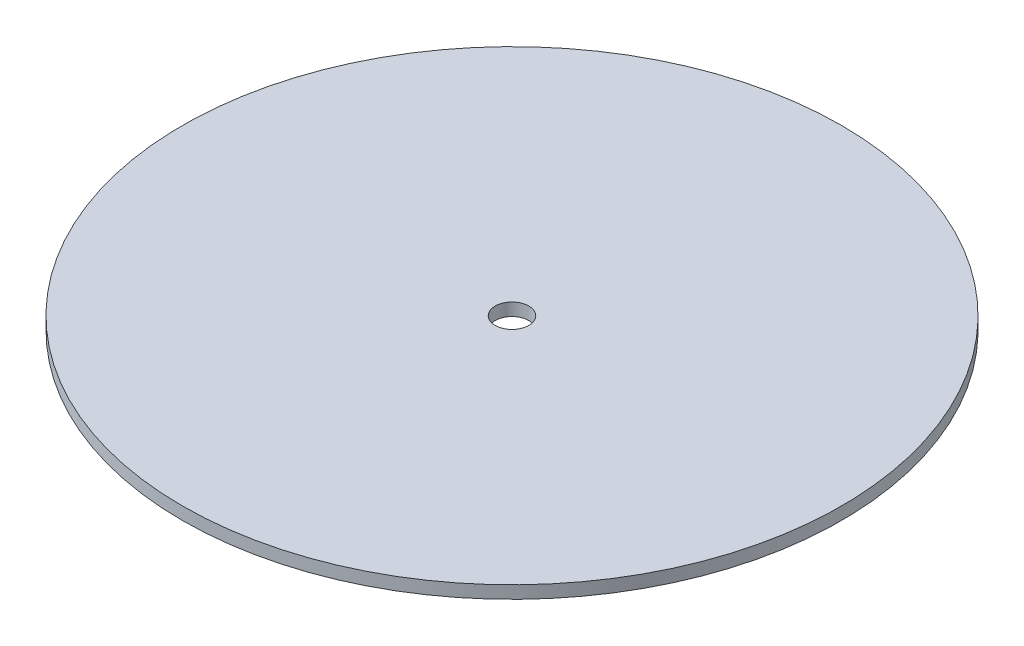
ISO-10303-21;
HEADER;
FILE_DESCRIPTION(('STEP AP214'),'2;1');
FILE_NAME('part.step','',(''),(''),'','','');
FILE_SCHEMA(('AUTOMOTIVE_DESIGN { 1 0 10303 214 1 1 1 1 }'));
ENDSEC;
DATA;
#1=APPLICATION_CONTEXT('core data for automotive mechanical design processes');
#2=APPLICATION_PROTOCOL_DEFINITION('international standard','automotive_design',2000,#1);
#3=PRODUCT_CONTEXT('',#1,'mechanical');
#4=PRODUCT('Part','Part','',(#3));
#5=PRODUCT_RELATED_PRODUCT_CATEGORY('part','',(#4));
#6=PRODUCT_DEFINITION_FORMATION('','',#4);
#7=PRODUCT_DEFINITION_CONTEXT('part definition',#1,'design');
#8=PRODUCT_DEFINITION('design','',#6,#7);
#9=PRODUCT_DEFINITION_SHAPE('','',#8);
#10=(LENGTH_UNIT() NAMED_UNIT(*) SI_UNIT(.MILLI.,.METRE.));
#11=(NAMED_UNIT(*) PLANE_ANGLE_UNIT() SI_UNIT($,.RADIAN.));
#12=(NAMED_UNIT(*) SI_UNIT($,.STERADIAN.) SOLID_ANGLE_UNIT());
#13=UNCERTAINTY_MEASURE_WITH_UNIT(LENGTH_MEASURE(1.E-05),#10,'distance_accuracy_value','');
#14=(GEOMETRIC_REPRESENTATION_CONTEXT(3) GLOBAL_UNCERTAINTY_ASSIGNED_CONTEXT((#13)) GLOBAL_UNIT_ASSIGNED_CONTEXT((#10,
#11,#12)) REPRESENTATION_CONTEXT('',''));
#15=CARTESIAN_POINT('',(0.,0.,0.));
#16=DIRECTION('',(0.,0.,1.));
#17=DIRECTION('',(1.,0.,0.));
#18=AXIS2_PLACEMENT_3D('',#15,#16,#17);
#19=CARTESIAN_POINT('',(0.,3.,0.));
#20=DIRECTION('',(0.,1.,0.));
#21=DIRECTION('',(0.,0.,1.));
#22=AXIS2_PLACEMENT_3D('',#19,#20,#21);
#23=PLANE('',#22);
#24=CARTESIAN_POINT('',(0.,3.,0.));
#25=DIRECTION('',(0.,1.,0.));
#26=DIRECTION('',(0.,0.,1.));
#27=AXIS2_PLACEMENT_3D('',#24,#25,#26);
#28=CIRCLE('',#27,78.35);
#29=CARTESIAN_POINT('',(0.,3.,78.35));
#30=VERTEX_POINT('',#29);
#31=EDGE_CURVE('E10',#30,#30,#28,.T.);
#32=ORIENTED_EDGE('',*,*,#31,.T.);
#33=EDGE_LOOP('',(#32));
#34=FACE_BOUND('',#33,.T.);
#35=CARTESIAN_POINT('',(0.,3.,0.));
#36=DIRECTION('',(0.,1.,0.));
#37=DIRECTION('',(0.,0.,1.));
#38=AXIS2_PLACEMENT_3D('',#35,#36,#37);
#39=CIRCLE('',#38,4.);
#40=CARTESIAN_POINT('',(0.,3.,4.));
#41=VERTEX_POINT('',#40);
#42=EDGE_CURVE('E50',#41,#41,#39,.T.);
#43=ORIENTED_EDGE('',*,*,#42,.F.);
#44=EDGE_LOOP('',(#43));
#45=FACE_BOUND('',#44,.T.);
#46=ADVANCED_FACE('F37',(#34,#45),#23,.T.);
#47=CARTESIAN_POINT('',(0.,0.,0.));
#48=DIRECTION('',(0.,1.,0.));
#49=DIRECTION('',(0.,0.,1.));
#50=AXIS2_PLACEMENT_3D('',#47,#48,#49);
#51=PLANE('',#50);
#52=CARTESIAN_POINT('',(0.,0.,0.));
#53=DIRECTION('',(0.,1.,0.));
#54=DIRECTION('',(0.,0.,1.));
#55=AXIS2_PLACEMENT_3D('',#52,#53,#54);
#56=CIRCLE('',#55,78.35);
#57=CARTESIAN_POINT('',(0.,0.,78.35));
#58=VERTEX_POINT('',#57);
#59=EDGE_CURVE('E41',#58,#58,#56,.T.);
#60=ORIENTED_EDGE('',*,*,#59,.F.);
#61=EDGE_LOOP('',(#60));
#62=FACE_BOUND('',#61,.T.);
#63=CARTESIAN_POINT('',(0.,0.,0.));
#64=DIRECTION('',(0.,1.,0.));
#65=DIRECTION('',(0.,0.,1.));
#66=AXIS2_PLACEMENT_3D('',#63,#64,#65);
#67=CIRCLE('',#66,4.);
#68=CARTESIAN_POINT('',(0.,0.,4.));
#69=VERTEX_POINT('',#68);
#70=EDGE_CURVE('E52',#69,#69,#67,.T.);
#71=ORIENTED_EDGE('',*,*,#70,.T.);
#72=EDGE_LOOP('',(#71));
#73=FACE_BOUND('',#72,.T.);
#74=ADVANCED_FACE('F64',(#62,#73),#51,.F.);
#75=CARTESIAN_POINT('',(0.,3.,0.));
#76=DIRECTION('',(0.,-1.,0.));
#77=DIRECTION('',(0.,0.,-1.));
#78=AXIS2_PLACEMENT_3D('',#75,#76,#77);
#79=CYLINDRICAL_SURFACE('',#78,78.35);
#80=ORIENTED_EDGE('',*,*,#31,.F.);
#81=EDGE_LOOP('',(#80));
#82=FACE_BOUND('',#81,.T.);
#83=ORIENTED_EDGE('',*,*,#59,.T.);
#84=EDGE_LOOP('',(#83));
#85=FACE_BOUND('',#84,.T.);
#86=ADVANCED_FACE('F39',(#82,#85),#79,.T.);
#87=CARTESIAN_POINT('',(0.,3.,0.));
#88=DIRECTION('',(0.,-1.,0.));
#89=DIRECTION('',(0.,0.,-1.));
#90=AXIS2_PLACEMENT_3D('',#87,#88,#89);
#91=CYLINDRICAL_SURFACE('',#90,4.);
#92=ORIENTED_EDGE('',*,*,#42,.T.);
#93=EDGE_LOOP('',(#92));
#94=FACE_BOUND('',#93,.T.);
#95=ORIENTED_EDGE('',*,*,#70,.F.);
#96=EDGE_LOOP('',(#95));
#97=FACE_BOUND('',#96,.T.);
#98=ADVANCED_FACE('F60',(#94,#97),#91,.F.);
#99=CLOSED_SHELL('',(#46,#74,#86,#98));
#100=MANIFOLD_SOLID_BREP('B2',#99);
#101=ADVANCED_BREP_SHAPE_REPRESENTATION('',(#18,#100),#14);
#102=SHAPE_DEFINITION_REPRESENTATION(#9,#101);
ENDSEC;
END-ISO-10303-21;
